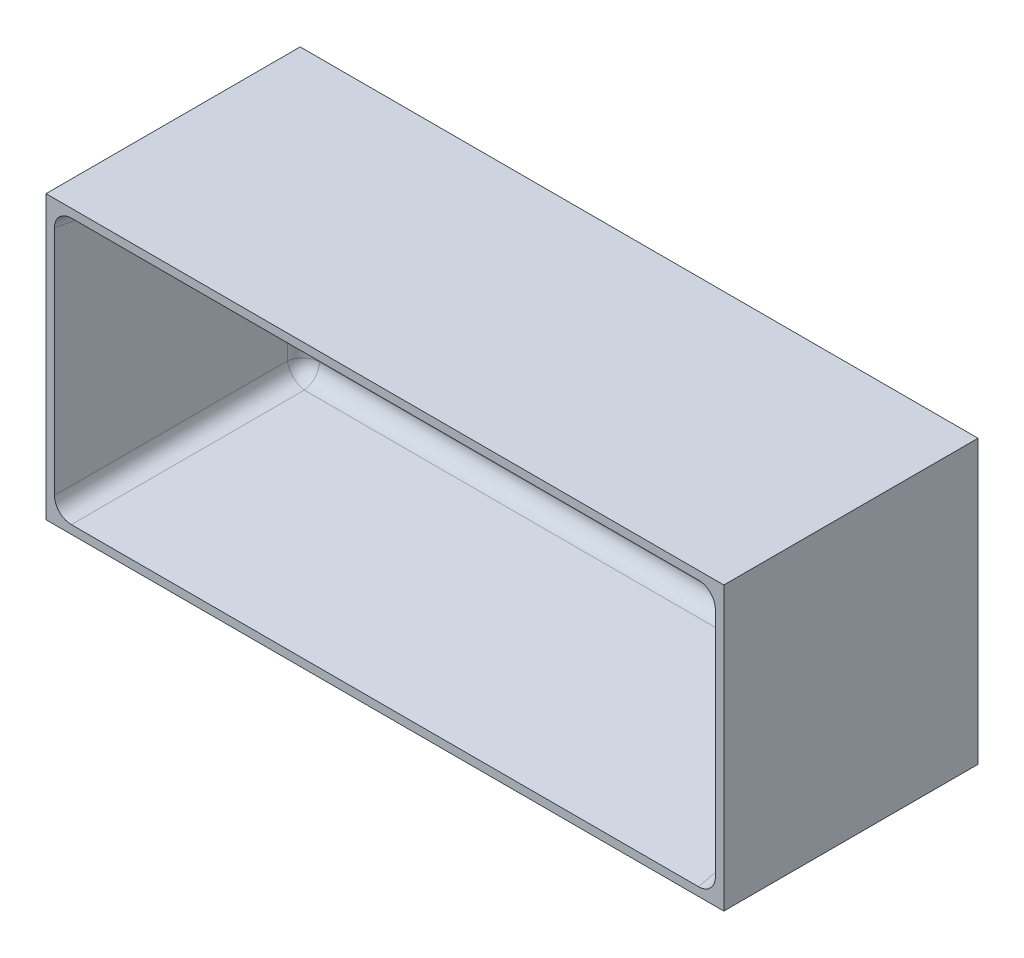
ISO-10303-21;
HEADER;
FILE_DESCRIPTION(('STEP AP214'),'2;1');
FILE_NAME('part.step','',(''),(''),'','','');
FILE_SCHEMA(('AUTOMOTIVE_DESIGN { 1 0 10303 214 1 1 1 1 }'));
ENDSEC;
DATA;
#1=APPLICATION_CONTEXT('core data for automotive mechanical design processes');
#2=APPLICATION_PROTOCOL_DEFINITION('international standard','automotive_design',2000,#1);
#3=PRODUCT_CONTEXT('',#1,'mechanical');
#4=PRODUCT('Part','Part','',(#3));
#5=PRODUCT_RELATED_PRODUCT_CATEGORY('part','',(#4));
#6=PRODUCT_DEFINITION_FORMATION('','',#4);
#7=PRODUCT_DEFINITION_CONTEXT('part definition',#1,'design');
#8=PRODUCT_DEFINITION('design','',#6,#7);
#9=PRODUCT_DEFINITION_SHAPE('','',#8);
#10=(LENGTH_UNIT() NAMED_UNIT(*) SI_UNIT(.MILLI.,.METRE.));
#11=(NAMED_UNIT(*) PLANE_ANGLE_UNIT() SI_UNIT($,.RADIAN.));
#12=(NAMED_UNIT(*) SI_UNIT($,.STERADIAN.) SOLID_ANGLE_UNIT());
#13=UNCERTAINTY_MEASURE_WITH_UNIT(LENGTH_MEASURE(1.E-05),#10,'distance_accuracy_value','');
#14=(GEOMETRIC_REPRESENTATION_CONTEXT(3) GLOBAL_UNCERTAINTY_ASSIGNED_CONTEXT((#13)) GLOBAL_UNIT_ASSIGNED_CONTEXT((#10,
#11,#12)) REPRESENTATION_CONTEXT('',''));
#15=CARTESIAN_POINT('',(0.,0.,0.));
#16=DIRECTION('',(0.,0.,1.));
#17=DIRECTION('',(1.,0.,0.));
#18=AXIS2_PLACEMENT_3D('',#15,#16,#17);
#19=CARTESIAN_POINT('',(60.,25.,5.));
#20=DIRECTION('',(-1.,0.,0.));
#21=DIRECTION('',(0.,0.,1.));
#22=AXIS2_PLACEMENT_3D('',#19,#20,#21);
#23=PLANE('',#22);
#24=DIRECTION('',(0.,1.,0.));
#25=VECTOR('',#24,1.);
#26=CARTESIAN_POINT('',(60.,25.,0.));
#27=LINE('',#26,#25);
#28=CARTESIAN_POINT('',(60.,-25.,0.));
#29=VERTEX_POINT('',#28);
#30=CARTESIAN_POINT('',(60.,25.,0.));
#31=VERTEX_POINT('',#30);
#32=EDGE_CURVE('E190',#29,#31,#27,.T.);
#33=ORIENTED_EDGE('',*,*,#32,.T.);
#34=DIRECTION('',(0.,0.,-1.));
#35=VECTOR('',#34,1.);
#36=CARTESIAN_POINT('',(60.,25.,5.));
#37=LINE('',#36,#35);
#38=CARTESIAN_POINT('',(60.,25.,45.));
#39=VERTEX_POINT('',#38);
#40=EDGE_CURVE('E165',#39,#31,#37,.T.);
#41=ORIENTED_EDGE('',*,*,#40,.F.);
#42=DIRECTION('',(0.,1.,0.));
#43=VECTOR('',#42,1.);
#44=CARTESIAN_POINT('',(60.,-25.,45.));
#45=LINE('',#44,#43);
#46=CARTESIAN_POINT('',(60.,-25.,45.));
#47=VERTEX_POINT('',#46);
#48=EDGE_CURVE('E163',#47,#39,#45,.T.);
#49=ORIENTED_EDGE('',*,*,#48,.F.);
#50=DIRECTION('',(0.,0.,-1.));
#51=VECTOR('',#50,1.);
#52=CARTESIAN_POINT('',(60.,-25.,5.));
#53=LINE('',#52,#51);
#54=EDGE_CURVE('E148',#47,#29,#53,.T.);
#55=ORIENTED_EDGE('',*,*,#54,.T.);
#56=EDGE_LOOP('',(#33,#41,#49,#55));
#57=FACE_BOUND('',#56,.T.);
#58=ADVANCED_FACE('F45',(#57),#23,.F.);
#59=CARTESIAN_POINT('',(-60.,25.,5.));
#60=DIRECTION('',(0.,-1.,0.));
#61=DIRECTION('',(1.,0.,0.));
#62=AXIS2_PLACEMENT_3D('',#59,#60,#61);
#63=PLANE('',#62);
#64=DIRECTION('',(-1.,0.,0.));
#65=VECTOR('',#64,1.);
#66=CARTESIAN_POINT('',(-60.,25.,0.));
#67=LINE('',#66,#65);
#68=CARTESIAN_POINT('',(-60.,25.,0.));
#69=VERTEX_POINT('',#68);
#70=EDGE_CURVE('E193',#31,#69,#67,.T.);
#71=ORIENTED_EDGE('',*,*,#70,.T.);
#72=DIRECTION('',(0.,0.,-1.));
#73=VECTOR('',#72,1.);
#74=CARTESIAN_POINT('',(-60.,25.,5.));
#75=LINE('',#74,#73);
#76=CARTESIAN_POINT('',(-60.,25.,45.));
#77=VERTEX_POINT('',#76);
#78=EDGE_CURVE('E203',#77,#69,#75,.T.);
#79=ORIENTED_EDGE('',*,*,#78,.F.);
#80=DIRECTION('',(-1.,0.,0.));
#81=VECTOR('',#80,1.);
#82=CARTESIAN_POINT('',(60.,25.,45.));
#83=LINE('',#82,#81);
#84=EDGE_CURVE('E170',#39,#77,#83,.T.);
#85=ORIENTED_EDGE('',*,*,#84,.F.);
#86=ORIENTED_EDGE('',*,*,#40,.T.);
#87=EDGE_LOOP('',(#71,#79,#85,#86));
#88=FACE_BOUND('',#87,.T.);
#89=ADVANCED_FACE('F384',(#88),#63,.F.);
#90=CARTESIAN_POINT('',(-60.,25.,5.));
#91=DIRECTION('',(1.,0.,0.));
#92=DIRECTION('',(0.,0.,-1.));
#93=AXIS2_PLACEMENT_3D('',#90,#91,#92);
#94=PLANE('',#93);
#95=DIRECTION('',(0.,-1.,0.));
#96=VECTOR('',#95,1.);
#97=CARTESIAN_POINT('',(-60.,25.,0.));
#98=LINE('',#97,#96);
#99=CARTESIAN_POINT('',(-60.,-25.,0.));
#100=VERTEX_POINT('',#99);
#101=EDGE_CURVE('E196',#69,#100,#98,.T.);
#102=ORIENTED_EDGE('',*,*,#101,.T.);
#103=DIRECTION('',(0.,0.,-1.));
#104=VECTOR('',#103,1.);
#105=CARTESIAN_POINT('',(-60.,-25.,5.));
#106=LINE('',#105,#104);
#107=CARTESIAN_POINT('',(-60.,-25.,45.));
#108=VERTEX_POINT('',#107);
#109=EDGE_CURVE('E160',#108,#100,#106,.T.);
#110=ORIENTED_EDGE('',*,*,#109,.F.);
#111=DIRECTION('',(0.,-1.,0.));
#112=VECTOR('',#111,1.);
#113=CARTESIAN_POINT('',(-60.,25.,45.));
#114=LINE('',#113,#112);
#115=EDGE_CURVE('E176',#77,#108,#114,.T.);
#116=ORIENTED_EDGE('',*,*,#115,.F.);
#117=ORIENTED_EDGE('',*,*,#78,.T.);
#118=EDGE_LOOP('',(#102,#110,#116,#117));
#119=FACE_BOUND('',#118,.T.);
#120=ADVANCED_FACE('F390',(#119),#94,.F.);
#121=CARTESIAN_POINT('',(-60.,-25.,5.));
#122=DIRECTION('',(0.,1.,0.));
#123=DIRECTION('',(0.,0.,1.));
#124=AXIS2_PLACEMENT_3D('',#121,#122,#123);
#125=PLANE('',#124);
#126=DIRECTION('',(1.,0.,0.));
#127=VECTOR('',#126,1.);
#128=CARTESIAN_POINT('',(-60.,-25.,0.));
#129=LINE('',#128,#127);
#130=EDGE_CURVE('E155',#100,#29,#129,.T.);
#131=ORIENTED_EDGE('',*,*,#130,.T.);
#132=ORIENTED_EDGE('',*,*,#54,.F.);
#133=DIRECTION('',(1.,0.,0.));
#134=VECTOR('',#133,1.);
#135=CARTESIAN_POINT('',(-60.,-25.,45.));
#136=LINE('',#135,#134);
#137=EDGE_CURVE('E153',#108,#47,#136,.T.);
#138=ORIENTED_EDGE('',*,*,#137,.F.);
#139=ORIENTED_EDGE('',*,*,#109,.T.);
#140=EDGE_LOOP('',(#131,#132,#138,#139));
#141=FACE_BOUND('',#140,.T.);
#142=ADVANCED_FACE('F150',(#141),#125,.F.);
#143=CARTESIAN_POINT('',(0.,0.,0.));
#144=DIRECTION('',(0.,0.,1.));
#145=DIRECTION('',(1.,0.,0.));
#146=AXIS2_PLACEMENT_3D('',#143,#144,#145);
#147=PLANE('',#146);
#148=ORIENTED_EDGE('',*,*,#32,.F.);
#149=ORIENTED_EDGE('',*,*,#130,.F.);
#150=ORIENTED_EDGE('',*,*,#101,.F.);
#151=ORIENTED_EDGE('',*,*,#70,.F.);
#152=EDGE_LOOP('',(#148,#149,#150,#151));
#153=FACE_BOUND('',#152,.T.);
#154=ADVANCED_FACE('F517',(#153),#147,.F.);
#155=CARTESIAN_POINT('',(0.,0.,45.));
#156=DIRECTION('',(0.,0.,1.));
#157=DIRECTION('',(1.,0.,0.));
#158=AXIS2_PLACEMENT_3D('',#155,#156,#157);
#159=PLANE('',#158);
#160=ORIENTED_EDGE('',*,*,#137,.T.);
#161=ORIENTED_EDGE('',*,*,#48,.T.);
#162=ORIENTED_EDGE('',*,*,#84,.T.);
#163=ORIENTED_EDGE('',*,*,#115,.T.);
#164=EDGE_LOOP('',(#160,#161,#162,#163));
#165=FACE_BOUND('',#164,.T.);
#166=DIRECTION('',(-1.,0.,0.));
#167=VECTOR('',#166,1.);
#168=CARTESIAN_POINT('',(-58.5,23.5,45.));
#169=LINE('',#168,#167);
#170=CARTESIAN_POINT('',(55.5164343138952,23.5,45.));
#171=VERTEX_POINT('',#170);
#172=CARTESIAN_POINT('',(-55.5164343138952,23.5,45.));
#173=VERTEX_POINT('',#172);
#174=EDGE_CURVE('E315',#171,#173,#169,.T.);
#175=ORIENTED_EDGE('',*,*,#174,.F.);
#176=CARTESIAN_POINT('',(55.4834751613094,20.4834751613095,45.));
#177=DIRECTION('',(0.,0.,1.));
#178=DIRECTION('',(0.707106781186548,0.707106781186548,0.));
#179=AXIS2_PLACEMENT_3D('',#176,#177,#178);
#180=ELLIPSE('',#179,3.03295964445195,3.);
#181=CARTESIAN_POINT('',(58.5,20.5164343138952,45.));
#182=VERTEX_POINT('',#181);
#183=EDGE_CURVE('E11',#171,#182,#180,.F.);
#184=ORIENTED_EDGE('',*,*,#183,.T.);
#185=DIRECTION('',(0.,1.,0.));
#186=VECTOR('',#185,1.);
#187=CARTESIAN_POINT('',(58.5,23.5,45.));
#188=LINE('',#187,#186);
#189=CARTESIAN_POINT('',(58.5,-20.5164343138952,45.));
#190=VERTEX_POINT('',#189);
#191=EDGE_CURVE('E311',#190,#182,#188,.T.);
#192=ORIENTED_EDGE('',*,*,#191,.F.);
#193=CARTESIAN_POINT('',(55.4834751613094,-20.4834751613095,45.));
#194=DIRECTION('',(0.,0.,1.));
#195=DIRECTION('',(0.707106781186548,-0.707106781186548,0.));
#196=AXIS2_PLACEMENT_3D('',#193,#194,#195);
#197=ELLIPSE('',#196,3.03295964445195,3.);
#198=CARTESIAN_POINT('',(55.5164343138952,-23.5,45.));
#199=VERTEX_POINT('',#198);
#200=EDGE_CURVE('E55',#190,#199,#197,.F.);
#201=ORIENTED_EDGE('',*,*,#200,.T.);
#202=DIRECTION('',(1.,0.,0.));
#203=VECTOR('',#202,1.);
#204=CARTESIAN_POINT('',(-58.5,-23.5,45.));
#205=LINE('',#204,#203);
#206=CARTESIAN_POINT('',(-55.5164343138952,-23.5,45.));
#207=VERTEX_POINT('',#206);
#208=EDGE_CURVE('E178',#207,#199,#205,.T.);
#209=ORIENTED_EDGE('',*,*,#208,.F.);
#210=CARTESIAN_POINT('',(-55.4834751613094,-20.4834751613095,45.));
#211=DIRECTION('',(0.,0.,1.));
#212=DIRECTION('',(-0.707106781186548,-0.707106781186548,0.));
#213=AXIS2_PLACEMENT_3D('',#210,#211,#212);
#214=ELLIPSE('',#213,3.03295964445195,3.);
#215=CARTESIAN_POINT('',(-58.5,-20.5164343138952,45.));
#216=VERTEX_POINT('',#215);
#217=EDGE_CURVE('E257',#207,#216,#214,.F.);
#218=ORIENTED_EDGE('',*,*,#217,.T.);
#219=DIRECTION('',(0.,-1.,0.));
#220=VECTOR('',#219,1.);
#221=CARTESIAN_POINT('',(-58.5,23.5,45.));
#222=LINE('',#221,#220);
#223=CARTESIAN_POINT('',(-58.5,20.5164343138952,45.));
#224=VERTEX_POINT('',#223);
#225=EDGE_CURVE('E182',#224,#216,#222,.T.);
#226=ORIENTED_EDGE('',*,*,#225,.F.);
#227=CARTESIAN_POINT('',(-55.4834751613094,20.4834751613095,45.));
#228=DIRECTION('',(0.,0.,1.));
#229=DIRECTION('',(-0.707106781186548,0.707106781186548,0.));
#230=AXIS2_PLACEMENT_3D('',#227,#228,#229);
#231=ELLIPSE('',#230,3.03295964445195,3.);
#232=EDGE_CURVE('E260',#224,#173,#231,.F.);
#233=ORIENTED_EDGE('',*,*,#232,.T.);
#234=EDGE_LOOP('',(#175,#184,#192,#201,#209,#218,#226,#233));
#235=FACE_BOUND('',#234,.T.);
#236=ADVANCED_FACE('F173',(#165,#235),#159,.T.);
#237=CARTESIAN_POINT('',(58.5,23.5,45.));
#238=DIRECTION('',(-0.994521895368273,0.,0.104528463267654));
#239=DIRECTION('',(0.104528463267654,0.,0.994521895368273));
#240=AXIS2_PLACEMENT_3D('',#237,#238,#239);
#241=PLANE('',#240);
#242=DIRECTION('',(0.,1.,0.));
#243=VECTOR('',#242,1.);
#244=CARTESIAN_POINT('',(54.5781841425842,-19.2958305893729,7.68641461019704));
#245=LINE('',#244,#243);
#246=CARTESIAN_POINT('',(54.5781841425842,16.5946184564794,7.68641461019704));
#247=VERTEX_POINT('',#246);
#248=CARTESIAN_POINT('',(54.5781841425842,-16.5946184564794,7.68641461019704));
#249=VERTEX_POINT('',#248);
#250=EDGE_CURVE('E63',#247,#249,#245,.F.);
#251=ORIENTED_EDGE('',*,*,#250,.T.);
#252=DIRECTION('',(-0.103962051184498,0.103962051184498,-0.989132844377854));
#253=VECTOR('',#252,1.);
#254=CARTESIAN_POINT('',(58.5322467004185,-20.5486810143138,45.3068068602283));
#255=LINE('',#254,#253);
#256=EDGE_CURVE('E254',#249,#190,#255,.F.);
#257=ORIENTED_EDGE('',*,*,#256,.T.);
#258=ORIENTED_EDGE('',*,*,#191,.T.);
#259=DIRECTION('',(-0.103962051184498,-0.103962051184498,-0.989132844377854));
#260=VECTOR('',#259,1.);
#261=CARTESIAN_POINT('',(54.3280772897915,16.3445116036867,5.30680686022829));
#262=LINE('',#261,#260);
#263=EDGE_CURVE('E68',#182,#247,#262,.T.);
#264=ORIENTED_EDGE('',*,*,#263,.T.);
#265=EDGE_LOOP('',(#251,#257,#258,#264));
#266=FACE_BOUND('',#265,.T.);
#267=ADVANCED_FACE('F399',(#266),#241,.T.);
#268=CARTESIAN_POINT('',(-58.5,23.5,45.));
#269=DIRECTION('',(0.,-0.994521895368273,0.104528463267654));
#270=DIRECTION('',(0.,-0.104528463267654,-0.994521895368273));
#271=AXIS2_PLACEMENT_3D('',#268,#269,#270);
#272=PLANE('',#271);
#273=ORIENTED_EDGE('',*,*,#174,.T.);
#274=DIRECTION('',(0.103962051184498,-0.103962051184498,-0.989132844377854));
#275=VECTOR('',#274,1.);
#276=CARTESIAN_POINT('',(-51.3445116036866,19.3280772897915,5.30680686022829));
#277=LINE('',#276,#275);
#278=CARTESIAN_POINT('',(-51.5946184564794,19.5781841425842,7.68641461019704));
#279=VERTEX_POINT('',#278);
#280=EDGE_CURVE('E234',#173,#279,#277,.T.);
#281=ORIENTED_EDGE('',*,*,#280,.T.);
#282=DIRECTION('',(-1.,0.,0.));
#283=VECTOR('',#282,1.);
#284=CARTESIAN_POINT('',(54.2958305893729,19.5781841425842,7.68641461019704));
#285=LINE('',#284,#283);
#286=CARTESIAN_POINT('',(51.5946184564794,19.5781841425842,7.68641461019704));
#287=VERTEX_POINT('',#286);
#288=EDGE_CURVE('E231',#279,#287,#285,.F.);
#289=ORIENTED_EDGE('',*,*,#288,.T.);
#290=DIRECTION('',(-0.103962051184498,-0.103962051184498,-0.989132844377854));
#291=VECTOR('',#290,1.);
#292=CARTESIAN_POINT('',(55.5486810143137,23.5322467004186,45.3068068602283));
#293=LINE('',#292,#291);
#294=EDGE_CURVE('E228',#287,#171,#293,.F.);
#295=ORIENTED_EDGE('',*,*,#294,.T.);
#296=EDGE_LOOP('',(#273,#281,#289,#295));
#297=FACE_BOUND('',#296,.T.);
#298=ADVANCED_FACE('F354',(#297),#272,.T.);
#299=CARTESIAN_POINT('',(-58.5,23.5,45.));
#300=DIRECTION('',(0.994521895368273,0.,0.104528463267654));
#301=DIRECTION('',(0.104528463267654,0.,-0.994521895368273));
#302=AXIS2_PLACEMENT_3D('',#299,#300,#301);
#303=PLANE('',#302);
#304=ORIENTED_EDGE('',*,*,#225,.T.);
#305=DIRECTION('',(0.103962051184498,0.103962051184498,-0.989132844377854));
#306=VECTOR('',#305,1.);
#307=CARTESIAN_POINT('',(-54.3280772897915,-16.3445116036867,5.30680686022829));
#308=LINE('',#307,#306);
#309=CARTESIAN_POINT('',(-54.5781841425842,-16.5946184564794,7.68641461019704));
#310=VERTEX_POINT('',#309);
#311=EDGE_CURVE('E215',#216,#310,#308,.T.);
#312=ORIENTED_EDGE('',*,*,#311,.T.);
#313=DIRECTION('',(0.,-1.,0.));
#314=VECTOR('',#313,1.);
#315=CARTESIAN_POINT('',(-54.5781841425842,19.2958305893729,7.68641461019704));
#316=LINE('',#315,#314);
#317=CARTESIAN_POINT('',(-54.5781841425842,16.5946184564794,7.68641461019704));
#318=VERTEX_POINT('',#317);
#319=EDGE_CURVE('E209',#310,#318,#316,.F.);
#320=ORIENTED_EDGE('',*,*,#319,.T.);
#321=DIRECTION('',(0.103962051184498,-0.103962051184498,-0.989132844377854));
#322=VECTOR('',#321,1.);
#323=CARTESIAN_POINT('',(-58.5322467004185,20.5486810143138,45.3068068602283));
#324=LINE('',#323,#322);
#325=EDGE_CURVE('E212',#318,#224,#324,.F.);
#326=ORIENTED_EDGE('',*,*,#325,.T.);
#327=EDGE_LOOP('',(#304,#312,#320,#326));
#328=FACE_BOUND('',#327,.T.);
#329=ADVANCED_FACE('F326',(#328),#303,.T.);
#330=CARTESIAN_POINT('',(-58.5,-23.5,45.));
#331=DIRECTION('',(0.,0.994521895368273,0.104528463267654));
#332=DIRECTION('',(0.,-0.104528463267654,0.994521895368273));
#333=AXIS2_PLACEMENT_3D('',#330,#331,#332);
#334=PLANE('',#333);
#335=DIRECTION('',(1.,0.,0.));
#336=VECTOR('',#335,1.);
#337=CARTESIAN_POINT('',(-54.2958305893729,-19.5781841425842,7.68641461019704));
#338=LINE('',#337,#336);
#339=CARTESIAN_POINT('',(51.5946184564794,-19.5781841425842,7.68641461019704));
#340=VERTEX_POINT('',#339);
#341=CARTESIAN_POINT('',(-51.5946184564794,-19.5781841425842,7.68641461019704));
#342=VERTEX_POINT('',#341);
#343=EDGE_CURVE('E222',#340,#342,#338,.F.);
#344=ORIENTED_EDGE('',*,*,#343,.T.);
#345=DIRECTION('',(0.103962051184498,0.103962051184498,-0.989132844377854));
#346=VECTOR('',#345,1.);
#347=CARTESIAN_POINT('',(-55.5486810143137,-23.5322467004186,45.3068068602283));
#348=LINE('',#347,#346);
#349=EDGE_CURVE('E225',#342,#207,#348,.F.);
#350=ORIENTED_EDGE('',*,*,#349,.T.);
#351=ORIENTED_EDGE('',*,*,#208,.T.);
#352=DIRECTION('',(-0.103962051184498,0.103962051184498,-0.989132844377854));
#353=VECTOR('',#352,1.);
#354=CARTESIAN_POINT('',(51.3445116036867,-19.3280772897915,5.3068068602283));
#355=LINE('',#354,#353);
#356=EDGE_CURVE('E219',#199,#340,#355,.T.);
#357=ORIENTED_EDGE('',*,*,#356,.T.);
#358=EDGE_LOOP('',(#344,#350,#351,#357));
#359=FACE_BOUND('',#358,.T.);
#360=ADVANCED_FACE('F367',(#359),#334,.T.);
#361=CARTESIAN_POINT('',(0.,0.,5.));
#362=DIRECTION('',(0.,0.,1.));
#363=DIRECTION('',(1.,0.,0.));
#364=AXIS2_PLACEMENT_3D('',#361,#362,#363);
#365=PLANE('',#364);
#366=DIRECTION('',(-1.,0.,0.));
#367=VECTOR('',#366,1.);
#368=CARTESIAN_POINT('',(-54.2958305893729,16.5946184564794,5.));
#369=LINE('',#368,#367);
#370=CARTESIAN_POINT('',(51.5946184564794,16.5946184564794,5.));
#371=VERTEX_POINT('',#370);
#372=CARTESIAN_POINT('',(-51.5946184564794,16.5946184564794,5.));
#373=VERTEX_POINT('',#372);
#374=EDGE_CURVE('E243',#371,#373,#369,.T.);
#375=ORIENTED_EDGE('',*,*,#374,.T.);
#376=DIRECTION('',(0.,-1.,0.));
#377=VECTOR('',#376,1.);
#378=CARTESIAN_POINT('',(-51.5946184564794,-19.2958305893729,5.));
#379=LINE('',#378,#377);
#380=CARTESIAN_POINT('',(-51.5946184564794,-16.5946184564794,5.));
#381=VERTEX_POINT('',#380);
#382=EDGE_CURVE('E246',#373,#381,#379,.T.);
#383=ORIENTED_EDGE('',*,*,#382,.T.);
#384=DIRECTION('',(1.,0.,0.));
#385=VECTOR('',#384,1.);
#386=CARTESIAN_POINT('',(54.2958305893729,-16.5946184564794,5.));
#387=LINE('',#386,#385);
#388=CARTESIAN_POINT('',(51.5946184564794,-16.5946184564794,5.));
#389=VERTEX_POINT('',#388);
#390=EDGE_CURVE('E240',#381,#389,#387,.T.);
#391=ORIENTED_EDGE('',*,*,#390,.T.);
#392=DIRECTION('',(0.,1.,0.));
#393=VECTOR('',#392,1.);
#394=CARTESIAN_POINT('',(51.5946184564794,19.2958305893729,5.));
#395=LINE('',#394,#393);
#396=EDGE_CURVE('E237',#389,#371,#395,.T.);
#397=ORIENTED_EDGE('',*,*,#396,.T.);
#398=EDGE_LOOP('',(#375,#383,#391,#397));
#399=FACE_BOUND('',#398,.T.);
#400=ADVANCED_FACE('F373',(#399),#365,.T.);
#401=CARTESIAN_POINT('',(55.5486810143137,20.5486810143138,45.6203922500313));
#402=DIRECTION('',(0.103962051184498,0.103962051184498,0.989132844377854));
#403=DIRECTION('',(0.994521895368273,0.,-0.104528463267654));
#404=AXIS2_PLACEMENT_3D('',#401,#402,#403);
#405=CYLINDRICAL_SURFACE('',#404,3.);
#406=CARTESIAN_POINT('',(51.5946184564794,16.5946184564794,8.));
#407=DIRECTION('',(0.103962051184498,0.103962051184498,0.989132844377854));
#408=DIRECTION('',(0.,-0.994521895368273,0.104528463267654));
#409=AXIS2_PLACEMENT_3D('',#406,#407,#408);
#410=CIRCLE('',#409,3.);
#411=EDGE_CURVE('E49',#247,#287,#410,.T.);
#412=ORIENTED_EDGE('',*,*,#411,.F.);
#413=ORIENTED_EDGE('',*,*,#263,.F.);
#414=ORIENTED_EDGE('',*,*,#183,.F.);
#415=ORIENTED_EDGE('',*,*,#294,.F.);
#416=EDGE_LOOP('',(#412,#413,#414,#415));
#417=FACE_BOUND('',#416,.T.);
#418=ADVANCED_FACE('F47',(#417),#405,.F.);
#419=CARTESIAN_POINT('',(51.5946184564794,16.5946184564794,8.));
#420=DIRECTION('',(0.,0.,-1.));
#421=DIRECTION('',(0.,1.,0.));
#422=AXIS2_PLACEMENT_3D('',#419,#420,#421);
#423=SPHERICAL_SURFACE('',#422,3.);
#424=CARTESIAN_POINT('',(51.5946184564794,16.5946184564794,8.));
#425=DIRECTION('',(0.,-1.,0.));
#426=DIRECTION('',(1.,0.,0.));
#427=AXIS2_PLACEMENT_3D('',#424,#425,#426);
#428=CIRCLE('',#427,3.);
#429=EDGE_CURVE('E299',#247,#371,#428,.F.);
#430=ORIENTED_EDGE('',*,*,#429,.F.);
#431=ORIENTED_EDGE('',*,*,#411,.T.);
#432=CARTESIAN_POINT('',(51.5946184564794,16.5946184564794,8.));
#433=DIRECTION('',(-1.,0.,0.));
#434=DIRECTION('',(0.,0.,1.));
#435=AXIS2_PLACEMENT_3D('',#432,#433,#434);
#436=CIRCLE('',#435,3.);
#437=EDGE_CURVE('E302',#371,#287,#436,.F.);
#438=ORIENTED_EDGE('',*,*,#437,.F.);
#439=EDGE_LOOP('',(#430,#431,#438));
#440=FACE_BOUND('',#439,.T.);
#441=ADVANCED_FACE('F376',(#440),#423,.F.);
#442=CARTESIAN_POINT('',(-55.5486810143137,20.5486810143138,45.6203922500313));
#443=DIRECTION('',(-0.103962051184498,0.103962051184498,0.989132844377854));
#444=DIRECTION('',(0.994521895368273,0.,0.104528463267654));
#445=AXIS2_PLACEMENT_3D('',#442,#443,#444);
#446=CYLINDRICAL_SURFACE('',#445,3.);
#447=ORIENTED_EDGE('',*,*,#232,.F.);
#448=ORIENTED_EDGE('',*,*,#325,.F.);
#449=CARTESIAN_POINT('',(-51.5946184564794,16.5946184564794,8.));
#450=DIRECTION('',(-0.103962051184498,0.103962051184498,0.989132844377854));
#451=DIRECTION('',(0.,-0.994521895368273,0.104528463267654));
#452=AXIS2_PLACEMENT_3D('',#449,#450,#451);
#453=CIRCLE('',#452,3.);
#454=EDGE_CURVE('E295',#279,#318,#453,.T.);
#455=ORIENTED_EDGE('',*,*,#454,.F.);
#456=ORIENTED_EDGE('',*,*,#280,.F.);
#457=EDGE_LOOP('',(#447,#448,#455,#456));
#458=FACE_BOUND('',#457,.T.);
#459=ADVANCED_FACE('F346',(#458),#446,.F.);
#460=CARTESIAN_POINT('',(0.,16.5946184564794,8.));
#461=DIRECTION('',(1.,0.,0.));
#462=DIRECTION('',(0.,0.,-1.));
#463=AXIS2_PLACEMENT_3D('',#460,#461,#462);
#464=CYLINDRICAL_SURFACE('',#463,3.);
#465=ORIENTED_EDGE('',*,*,#437,.T.);
#466=ORIENTED_EDGE('',*,*,#288,.F.);
#467=CARTESIAN_POINT('',(-51.5946184564794,16.5946184564794,8.));
#468=DIRECTION('',(1.,0.,0.));
#469=DIRECTION('',(0.,1.,0.));
#470=AXIS2_PLACEMENT_3D('',#467,#468,#469);
#471=CIRCLE('',#470,3.);
#472=EDGE_CURVE('E291',#373,#279,#471,.T.);
#473=ORIENTED_EDGE('',*,*,#472,.F.);
#474=ORIENTED_EDGE('',*,*,#374,.F.);
#475=EDGE_LOOP('',(#465,#466,#473,#474));
#476=FACE_BOUND('',#475,.T.);
#477=ADVANCED_FACE('F351',(#476),#464,.F.);
#478=CARTESIAN_POINT('',(51.5946184564794,0.,8.));
#479=DIRECTION('',(0.,-1.,0.));
#480=DIRECTION('',(0.,0.,-1.));
#481=AXIS2_PLACEMENT_3D('',#478,#479,#480);
#482=CYLINDRICAL_SURFACE('',#481,3.);
#483=ORIENTED_EDGE('',*,*,#429,.T.);
#484=ORIENTED_EDGE('',*,*,#396,.F.);
#485=CARTESIAN_POINT('',(51.5946184564794,-16.5946184564794,8.));
#486=DIRECTION('',(0.,1.,0.));
#487=DIRECTION('',(0.,0.,1.));
#488=AXIS2_PLACEMENT_3D('',#485,#486,#487);
#489=CIRCLE('',#488,3.);
#490=EDGE_CURVE('E287',#249,#389,#489,.T.);
#491=ORIENTED_EDGE('',*,*,#490,.F.);
#492=ORIENTED_EDGE('',*,*,#250,.F.);
#493=EDGE_LOOP('',(#483,#484,#491,#492));
#494=FACE_BOUND('',#493,.T.);
#495=ADVANCED_FACE('F375',(#494),#482,.F.);
#496=CARTESIAN_POINT('',(54.2841323681946,-19.2841323681946,33.5890155607603));
#497=DIRECTION('',(0.103962051184498,-0.103962051184498,0.989132844377854));
#498=DIRECTION('',(0.994521895368273,0.,-0.104528463267654));
#499=AXIS2_PLACEMENT_3D('',#496,#497,#498);
#500=CYLINDRICAL_SURFACE('',#499,3.);
#501=ORIENTED_EDGE('',*,*,#200,.F.);
#502=ORIENTED_EDGE('',*,*,#256,.F.);
#503=CARTESIAN_POINT('',(51.5946184564794,-16.5946184564794,8.));
#504=DIRECTION('',(0.103962051184498,-0.103962051184498,0.989132844377854));
#505=DIRECTION('',(0.,-0.994521895368273,-0.104528463267654));
#506=AXIS2_PLACEMENT_3D('',#503,#504,#505);
#507=CIRCLE('',#506,3.);
#508=EDGE_CURVE('E283',#340,#249,#507,.T.);
#509=ORIENTED_EDGE('',*,*,#508,.F.);
#510=ORIENTED_EDGE('',*,*,#356,.F.);
#511=EDGE_LOOP('',(#501,#502,#509,#510));
#512=FACE_BOUND('',#511,.T.);
#513=ADVANCED_FACE('F362',(#512),#500,.F.);
#514=CARTESIAN_POINT('',(-51.5946184564794,16.5946184564794,8.));
#515=DIRECTION('',(0.,0.,-1.));
#516=DIRECTION('',(0.,1.,0.));
#517=AXIS2_PLACEMENT_3D('',#514,#515,#516);
#518=SPHERICAL_SURFACE('',#517,3.);
#519=ORIENTED_EDGE('',*,*,#472,.T.);
#520=ORIENTED_EDGE('',*,*,#454,.T.);
#521=CARTESIAN_POINT('',(-51.5946184564794,16.5946184564794,8.));
#522=DIRECTION('',(0.,-1.,0.));
#523=DIRECTION('',(0.,0.,-1.));
#524=AXIS2_PLACEMENT_3D('',#521,#522,#523);
#525=CIRCLE('',#524,3.);
#526=EDGE_CURVE('E279',#373,#318,#525,.F.);
#527=ORIENTED_EDGE('',*,*,#526,.F.);
#528=EDGE_LOOP('',(#519,#520,#527));
#529=FACE_BOUND('',#528,.T.);
#530=ADVANCED_FACE('F349',(#529),#518,.F.);
#531=CARTESIAN_POINT('',(51.5946184564794,-16.5946184564794,8.));
#532=DIRECTION('',(0.,0.,-1.));
#533=DIRECTION('',(0.,1.,0.));
#534=AXIS2_PLACEMENT_3D('',#531,#532,#533);
#535=SPHERICAL_SURFACE('',#534,3.);
#536=ORIENTED_EDGE('',*,*,#508,.T.);
#537=ORIENTED_EDGE('',*,*,#490,.T.);
#538=CARTESIAN_POINT('',(51.5946184564794,-16.5946184564794,8.));
#539=DIRECTION('',(-1.,0.,0.));
#540=DIRECTION('',(0.,0.,1.));
#541=AXIS2_PLACEMENT_3D('',#538,#539,#540);
#542=CIRCLE('',#541,3.);
#543=EDGE_CURVE('E275',#340,#389,#542,.F.);
#544=ORIENTED_EDGE('',*,*,#543,.F.);
#545=EDGE_LOOP('',(#536,#537,#544));
#546=FACE_BOUND('',#545,.T.);
#547=ADVANCED_FACE('F412',(#546),#535,.F.);
#548=CARTESIAN_POINT('',(-51.5946184564794,0.,8.));
#549=DIRECTION('',(0.,1.,0.));
#550=DIRECTION('',(0.,0.,1.));
#551=AXIS2_PLACEMENT_3D('',#548,#549,#550);
#552=CYLINDRICAL_SURFACE('',#551,3.);
#553=ORIENTED_EDGE('',*,*,#526,.T.);
#554=ORIENTED_EDGE('',*,*,#319,.F.);
#555=CARTESIAN_POINT('',(-51.5946184564794,-16.5946184564794,8.));
#556=DIRECTION('',(0.,1.,0.));
#557=DIRECTION('',(0.,0.,1.));
#558=AXIS2_PLACEMENT_3D('',#555,#556,#557);
#559=CIRCLE('',#558,3.);
#560=EDGE_CURVE('E271',#381,#310,#559,.T.);
#561=ORIENTED_EDGE('',*,*,#560,.F.);
#562=ORIENTED_EDGE('',*,*,#382,.F.);
#563=EDGE_LOOP('',(#553,#554,#561,#562));
#564=FACE_BOUND('',#563,.T.);
#565=ADVANCED_FACE('F342',(#564),#552,.F.);
#566=CARTESIAN_POINT('',(0.,-16.5946184564794,8.));
#567=DIRECTION('',(-1.,0.,0.));
#568=DIRECTION('',(0.,0.,1.));
#569=AXIS2_PLACEMENT_3D('',#566,#567,#568);
#570=CYLINDRICAL_SURFACE('',#569,3.);
#571=ORIENTED_EDGE('',*,*,#543,.T.);
#572=ORIENTED_EDGE('',*,*,#390,.F.);
#573=CARTESIAN_POINT('',(-51.5946184564794,-16.5946184564794,8.));
#574=DIRECTION('',(1.,0.,0.));
#575=DIRECTION('',(0.,0.,-1.));
#576=AXIS2_PLACEMENT_3D('',#573,#574,#575);
#577=CIRCLE('',#576,3.);
#578=EDGE_CURVE('E268',#342,#381,#577,.T.);
#579=ORIENTED_EDGE('',*,*,#578,.F.);
#580=ORIENTED_EDGE('',*,*,#343,.F.);
#581=EDGE_LOOP('',(#571,#572,#579,#580));
#582=FACE_BOUND('',#581,.T.);
#583=ADVANCED_FACE('F370',(#582),#570,.F.);
#584=CARTESIAN_POINT('',(-51.5946184564794,-16.5946184564794,8.));
#585=DIRECTION('',(0.,0.,-1.));
#586=DIRECTION('',(0.,1.,0.));
#587=AXIS2_PLACEMENT_3D('',#584,#585,#586);
#588=SPHERICAL_SURFACE('',#587,3.);
#589=ORIENTED_EDGE('',*,*,#578,.T.);
#590=ORIENTED_EDGE('',*,*,#560,.T.);
#591=CARTESIAN_POINT('',(-51.5946184564794,-16.5946184564794,8.));
#592=DIRECTION('',(-0.103962051184498,-0.103962051184498,0.989132844377854));
#593=DIRECTION('',(0.,-0.994521895368273,-0.104528463267654));
#594=AXIS2_PLACEMENT_3D('',#591,#592,#593);
#595=CIRCLE('',#594,3.);
#596=EDGE_CURVE('E265',#342,#310,#595,.F.);
#597=ORIENTED_EDGE('',*,*,#596,.F.);
#598=EDGE_LOOP('',(#589,#590,#597));
#599=FACE_BOUND('',#598,.T.);
#600=ADVANCED_FACE('F337',(#599),#588,.F.);
#601=CARTESIAN_POINT('',(-55.0406999342488,-20.0406999342488,40.7872751184438));
#602=DIRECTION('',(-0.103962051184498,-0.103962051184498,0.989132844377854));
#603=DIRECTION('',(0.994521895368273,0.,0.104528463267654));
#604=AXIS2_PLACEMENT_3D('',#601,#602,#603);
#605=CYLINDRICAL_SURFACE('',#604,3.);
#606=ORIENTED_EDGE('',*,*,#217,.F.);
#607=ORIENTED_EDGE('',*,*,#349,.F.);
#608=ORIENTED_EDGE('',*,*,#596,.T.);
#609=ORIENTED_EDGE('',*,*,#311,.F.);
#610=EDGE_LOOP('',(#606,#607,#608,#609));
#611=FACE_BOUND('',#610,.T.);
#612=ADVANCED_FACE('F331',(#611),#605,.F.);
#613=CLOSED_SHELL('',(#58,#89,#120,#142,#154,#236,#267,#298,#329,#360,#400,#418,#441,#459,#477,
#495,#513,#530,#547,#565,#583,#600,#612));
#614=MANIFOLD_SOLID_BREP('B2',#613);
#615=ADVANCED_BREP_SHAPE_REPRESENTATION('',(#18,#614),#14);
#616=SHAPE_DEFINITION_REPRESENTATION(#9,#615);
ENDSEC;
END-ISO-10303-21;
